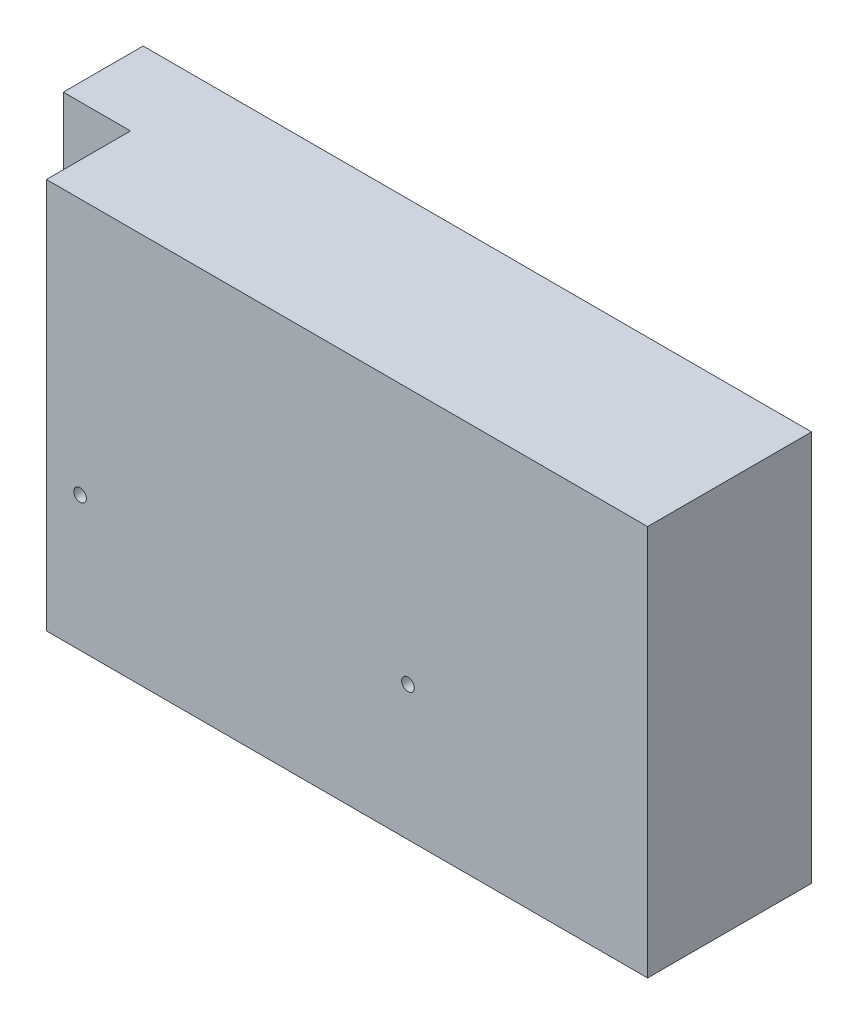
ISO-10303-21;
HEADER;
FILE_DESCRIPTION(('STEP AP214'),'2;1');
FILE_NAME('part.step','',(''),(''),'','','');
FILE_SCHEMA(('AUTOMOTIVE_DESIGN { 1 0 10303 214 1 1 1 1 }'));
ENDSEC;
DATA;
#1=APPLICATION_CONTEXT('core data for automotive mechanical design processes');
#2=APPLICATION_PROTOCOL_DEFINITION('international standard','automotive_design',2000,#1);
#3=PRODUCT_CONTEXT('',#1,'mechanical');
#4=PRODUCT('Part','Part','',(#3));
#5=PRODUCT_RELATED_PRODUCT_CATEGORY('part','',(#4));
#6=PRODUCT_DEFINITION_FORMATION('','',#4);
#7=PRODUCT_DEFINITION_CONTEXT('part definition',#1,'design');
#8=PRODUCT_DEFINITION('design','',#6,#7);
#9=PRODUCT_DEFINITION_SHAPE('','',#8);
#10=(LENGTH_UNIT() NAMED_UNIT(*) SI_UNIT(.MILLI.,.METRE.));
#11=(NAMED_UNIT(*) PLANE_ANGLE_UNIT() SI_UNIT($,.RADIAN.));
#12=(NAMED_UNIT(*) SI_UNIT($,.STERADIAN.) SOLID_ANGLE_UNIT());
#13=UNCERTAINTY_MEASURE_WITH_UNIT(LENGTH_MEASURE(1.E-05),#10,'distance_accuracy_value','');
#14=(GEOMETRIC_REPRESENTATION_CONTEXT(3) GLOBAL_UNCERTAINTY_ASSIGNED_CONTEXT((#13)) GLOBAL_UNIT_ASSIGNED_CONTEXT((#10,
#11,#12)) REPRESENTATION_CONTEXT('',''));
#15=CARTESIAN_POINT('',(0.,0.,0.));
#16=DIRECTION('',(0.,0.,1.));
#17=DIRECTION('',(1.,0.,0.));
#18=AXIS2_PLACEMENT_3D('',#15,#16,#17);
#19=CARTESIAN_POINT('',(-79.5,46.5,39.));
#20=DIRECTION('',(1.,0.,0.));
#21=DIRECTION('',(0.,0.,-1.));
#22=AXIS2_PLACEMENT_3D('',#19,#20,#21);
#23=PLANE('',#22);
#24=DIRECTION('',(0.,-1.,0.));
#25=VECTOR('',#24,1.);
#26=CARTESIAN_POINT('',(-79.5,46.5,19.));
#27=LINE('',#26,#25);
#28=CARTESIAN_POINT('',(-79.5,46.5,19.));
#29=VERTEX_POINT('',#28);
#30=CARTESIAN_POINT('',(-79.5,-46.5,19.));
#31=VERTEX_POINT('',#30);
#32=EDGE_CURVE('E113',#29,#31,#27,.T.);
#33=ORIENTED_EDGE('',*,*,#32,.F.);
#34=DIRECTION('',(0.,0.,-1.));
#35=VECTOR('',#34,1.);
#36=CARTESIAN_POINT('',(-79.5,46.5,39.));
#37=LINE('',#36,#35);
#38=CARTESIAN_POINT('',(-79.5,46.5,0.));
#39=VERTEX_POINT('',#38);
#40=EDGE_CURVE('E42',#29,#39,#37,.T.);
#41=ORIENTED_EDGE('',*,*,#40,.T.);
#42=DIRECTION('',(0.,-1.,0.));
#43=VECTOR('',#42,1.);
#44=CARTESIAN_POINT('',(-79.5,46.5,0.));
#45=LINE('',#44,#43);
#46=CARTESIAN_POINT('',(-79.5,-46.5,0.));
#47=VERTEX_POINT('',#46);
#48=EDGE_CURVE('E89',#39,#47,#45,.T.);
#49=ORIENTED_EDGE('',*,*,#48,.T.);
#50=DIRECTION('',(0.,0.,-1.));
#51=VECTOR('',#50,1.);
#52=CARTESIAN_POINT('',(-79.5,-46.5,39.));
#53=LINE('',#52,#51);
#54=EDGE_CURVE('E83',#31,#47,#53,.T.);
#55=ORIENTED_EDGE('',*,*,#54,.F.);
#56=EDGE_LOOP('',(#33,#41,#49,#55));
#57=FACE_BOUND('',#56,.T.);
#58=ADVANCED_FACE('F34',(#57),#23,.F.);
#59=CARTESIAN_POINT('',(79.5,46.5,39.));
#60=DIRECTION('',(-1.,0.,0.));
#61=DIRECTION('',(0.,-1.,0.));
#62=AXIS2_PLACEMENT_3D('',#59,#60,#61);
#63=PLANE('',#62);
#64=DIRECTION('',(0.,1.,0.));
#65=VECTOR('',#64,1.);
#66=CARTESIAN_POINT('',(79.5,46.5,0.));
#67=LINE('',#66,#65);
#68=CARTESIAN_POINT('',(79.5,-46.5,0.));
#69=VERTEX_POINT('',#68);
#70=CARTESIAN_POINT('',(79.5,46.5,0.));
#71=VERTEX_POINT('',#70);
#72=EDGE_CURVE('E94',#69,#71,#67,.T.);
#73=ORIENTED_EDGE('',*,*,#72,.T.);
#74=DIRECTION('',(0.,0.,-1.));
#75=VECTOR('',#74,1.);
#76=CARTESIAN_POINT('',(79.5,46.5,39.));
#77=LINE('',#76,#75);
#78=CARTESIAN_POINT('',(79.5,46.5,39.));
#79=VERTEX_POINT('',#78);
#80=EDGE_CURVE('E11',#79,#71,#77,.T.);
#81=ORIENTED_EDGE('',*,*,#80,.F.);
#82=DIRECTION('',(0.,1.,0.));
#83=VECTOR('',#82,1.);
#84=CARTESIAN_POINT('',(79.5,46.5,39.));
#85=LINE('',#84,#83);
#86=CARTESIAN_POINT('',(79.5,-46.5,39.));
#87=VERTEX_POINT('',#86);
#88=EDGE_CURVE('E88',#87,#79,#85,.T.);
#89=ORIENTED_EDGE('',*,*,#88,.F.);
#90=DIRECTION('',(0.,0.,-1.));
#91=VECTOR('',#90,1.);
#92=CARTESIAN_POINT('',(79.5,-46.5,39.));
#93=LINE('',#92,#91);
#94=EDGE_CURVE('E79',#87,#69,#93,.T.);
#95=ORIENTED_EDGE('',*,*,#94,.T.);
#96=EDGE_LOOP('',(#73,#81,#89,#95));
#97=FACE_BOUND('',#96,.T.);
#98=ADVANCED_FACE('F36',(#97),#63,.F.);
#99=CARTESIAN_POINT('',(-79.5,46.5,39.));
#100=DIRECTION('',(0.,-1.,0.));
#101=DIRECTION('',(0.,0.,-1.));
#102=AXIS2_PLACEMENT_3D('',#99,#100,#101);
#103=PLANE('',#102);
#104=DIRECTION('',(-1.,0.,0.));
#105=VECTOR('',#104,1.);
#106=CARTESIAN_POINT('',(-79.5,46.5,19.));
#107=LINE('',#106,#105);
#108=CARTESIAN_POINT('',(-63.5,46.5,19.));
#109=VERTEX_POINT('',#108);
#110=EDGE_CURVE('E136',#109,#29,#107,.T.);
#111=ORIENTED_EDGE('',*,*,#110,.F.);
#112=DIRECTION('',(0.,0.,1.));
#113=VECTOR('',#112,1.);
#114=CARTESIAN_POINT('',(-63.5,46.5,19.));
#115=LINE('',#114,#113);
#116=CARTESIAN_POINT('',(-63.5,46.5,39.));
#117=VERTEX_POINT('',#116);
#118=EDGE_CURVE('E122',#109,#117,#115,.T.);
#119=ORIENTED_EDGE('',*,*,#118,.T.);
#120=DIRECTION('',(-1.,0.,0.));
#121=VECTOR('',#120,1.);
#122=CARTESIAN_POINT('',(-79.5,46.5,39.));
#123=LINE('',#122,#121);
#124=EDGE_CURVE('E119',#79,#117,#123,.T.);
#125=ORIENTED_EDGE('',*,*,#124,.F.);
#126=ORIENTED_EDGE('',*,*,#80,.T.);
#127=DIRECTION('',(-1.,0.,0.));
#128=VECTOR('',#127,1.);
#129=CARTESIAN_POINT('',(-79.5,46.5,0.));
#130=LINE('',#129,#128);
#131=EDGE_CURVE('E98',#71,#39,#130,.T.);
#132=ORIENTED_EDGE('',*,*,#131,.T.);
#133=ORIENTED_EDGE('',*,*,#40,.F.);
#134=EDGE_LOOP('',(#111,#119,#125,#126,#132,#133));
#135=FACE_BOUND('',#134,.T.);
#136=ADVANCED_FACE('F116',(#135),#103,.F.);
#137=CARTESIAN_POINT('',(-79.5,-46.5,39.));
#138=DIRECTION('',(0.,1.,0.));
#139=DIRECTION('',(0.,0.,1.));
#140=AXIS2_PLACEMENT_3D('',#137,#138,#139);
#141=PLANE('',#140);
#142=DIRECTION('',(1.,0.,0.));
#143=VECTOR('',#142,1.);
#144=CARTESIAN_POINT('',(-79.5,-46.5,39.));
#145=LINE('',#144,#143);
#146=CARTESIAN_POINT('',(-63.5,-46.5,39.));
#147=VERTEX_POINT('',#146);
#148=EDGE_CURVE('E57',#147,#87,#145,.T.);
#149=ORIENTED_EDGE('',*,*,#148,.F.);
#150=DIRECTION('',(0.,0.,1.));
#151=VECTOR('',#150,1.);
#152=CARTESIAN_POINT('',(-63.5,-46.5,19.));
#153=LINE('',#152,#151);
#154=CARTESIAN_POINT('',(-63.5,-46.5,19.));
#155=VERTEX_POINT('',#154);
#156=EDGE_CURVE('E49',#155,#147,#153,.T.);
#157=ORIENTED_EDGE('',*,*,#156,.F.);
#158=DIRECTION('',(1.,0.,0.));
#159=VECTOR('',#158,1.);
#160=CARTESIAN_POINT('',(-79.5,-46.5,19.));
#161=LINE('',#160,#159);
#162=EDGE_CURVE('E145',#31,#155,#161,.T.);
#163=ORIENTED_EDGE('',*,*,#162,.F.);
#164=ORIENTED_EDGE('',*,*,#54,.T.);
#165=DIRECTION('',(1.,0.,0.));
#166=VECTOR('',#165,1.);
#167=CARTESIAN_POINT('',(-79.5,-46.5,0.));
#168=LINE('',#167,#166);
#169=EDGE_CURVE('E76',#47,#69,#168,.T.);
#170=ORIENTED_EDGE('',*,*,#169,.T.);
#171=ORIENTED_EDGE('',*,*,#94,.F.);
#172=EDGE_LOOP('',(#149,#157,#163,#164,#170,#171));
#173=FACE_BOUND('',#172,.T.);
#174=ADVANCED_FACE('F78',(#173),#141,.F.);
#175=CARTESIAN_POINT('',(0.,0.,39.));
#176=DIRECTION('',(0.,0.,1.));
#177=DIRECTION('',(1.,0.,0.));
#178=AXIS2_PLACEMENT_3D('',#175,#176,#177);
#179=PLANE('',#178);
#180=DIRECTION('',(0.,1.,0.));
#181=VECTOR('',#180,1.);
#182=CARTESIAN_POINT('',(-63.5,46.5,39.));
#183=LINE('',#182,#181);
#184=EDGE_CURVE('E138',#147,#117,#183,.T.);
#185=ORIENTED_EDGE('',*,*,#184,.F.);
#186=ORIENTED_EDGE('',*,*,#148,.T.);
#187=ORIENTED_EDGE('',*,*,#88,.T.);
#188=ORIENTED_EDGE('',*,*,#124,.T.);
#189=EDGE_LOOP('',(#185,#186,#187,#188));
#190=FACE_BOUND('',#189,.T.);
#191=CARTESIAN_POINT('',(22.5,-14.5,39.));
#192=DIRECTION('',(0.,0.,-1.));
#193=DIRECTION('',(-1.,0.,0.));
#194=AXIS2_PLACEMENT_3D('',#191,#192,#193);
#195=CIRCLE('',#194,1.5);
#196=CARTESIAN_POINT('',(21.,-14.5,39.));
#197=VERTEX_POINT('',#196);
#198=EDGE_CURVE('E99',#197,#197,#195,.T.);
#199=ORIENTED_EDGE('',*,*,#198,.T.);
#200=EDGE_LOOP('',(#199));
#201=FACE_BOUND('',#200,.T.);
#202=CARTESIAN_POINT('',(-55.5,-14.5,39.));
#203=DIRECTION('',(0.,0.,-1.));
#204=DIRECTION('',(-1.,0.,0.));
#205=AXIS2_PLACEMENT_3D('',#202,#203,#204);
#206=CIRCLE('',#205,1.5);
#207=CARTESIAN_POINT('',(-57.,-14.5,39.));
#208=VERTEX_POINT('',#207);
#209=EDGE_CURVE('E130',#208,#208,#206,.T.);
#210=ORIENTED_EDGE('',*,*,#209,.T.);
#211=EDGE_LOOP('',(#210));
#212=FACE_BOUND('',#211,.T.);
#213=ADVANCED_FACE('F123',(#190,#201,#212),#179,.T.);
#214=CARTESIAN_POINT('',(0.,0.,0.));
#215=DIRECTION('',(0.,0.,1.));
#216=DIRECTION('',(1.,0.,0.));
#217=AXIS2_PLACEMENT_3D('',#214,#215,#216);
#218=PLANE('',#217);
#219=CARTESIAN_POINT('',(22.5,-14.5,0.));
#220=DIRECTION('',(0.,0.,-1.));
#221=DIRECTION('',(-1.,0.,0.));
#222=AXIS2_PLACEMENT_3D('',#219,#220,#221);
#223=CIRCLE('',#222,1.5);
#224=CARTESIAN_POINT('',(21.,-14.5,0.));
#225=VERTEX_POINT('',#224);
#226=EDGE_CURVE('E103',#225,#225,#223,.T.);
#227=ORIENTED_EDGE('',*,*,#226,.F.);
#228=EDGE_LOOP('',(#227));
#229=FACE_BOUND('',#228,.T.);
#230=CARTESIAN_POINT('',(-55.5,-14.5,0.));
#231=DIRECTION('',(0.,0.,-1.));
#232=DIRECTION('',(-1.,0.,0.));
#233=AXIS2_PLACEMENT_3D('',#230,#231,#232);
#234=CIRCLE('',#233,1.5);
#235=CARTESIAN_POINT('',(-57.,-14.5,0.));
#236=VERTEX_POINT('',#235);
#237=EDGE_CURVE('E127',#236,#236,#234,.T.);
#238=ORIENTED_EDGE('',*,*,#237,.F.);
#239=EDGE_LOOP('',(#238));
#240=FACE_BOUND('',#239,.T.);
#241=ORIENTED_EDGE('',*,*,#72,.F.);
#242=ORIENTED_EDGE('',*,*,#169,.F.);
#243=ORIENTED_EDGE('',*,*,#48,.F.);
#244=ORIENTED_EDGE('',*,*,#131,.F.);
#245=EDGE_LOOP('',(#241,#242,#243,#244));
#246=FACE_BOUND('',#245,.T.);
#247=ADVANCED_FACE('F96',(#229,#240,#246),#218,.F.);
#248=CARTESIAN_POINT('',(-55.5,-14.5,39.));
#249=DIRECTION('',(0.,0.,-1.));
#250=DIRECTION('',(-1.,0.,0.));
#251=AXIS2_PLACEMENT_3D('',#248,#249,#250);
#252=CYLINDRICAL_SURFACE('',#251,1.5);
#253=ORIENTED_EDGE('',*,*,#209,.F.);
#254=EDGE_LOOP('',(#253));
#255=FACE_BOUND('',#254,.T.);
#256=ORIENTED_EDGE('',*,*,#237,.T.);
#257=EDGE_LOOP('',(#256));
#258=FACE_BOUND('',#257,.T.);
#259=ADVANCED_FACE('F166',(#255,#258),#252,.F.);
#260=CARTESIAN_POINT('',(22.5,-14.5,39.));
#261=DIRECTION('',(0.,0.,-1.));
#262=DIRECTION('',(-1.,0.,0.));
#263=AXIS2_PLACEMENT_3D('',#260,#261,#262);
#264=CYLINDRICAL_SURFACE('',#263,1.5);
#265=ORIENTED_EDGE('',*,*,#198,.F.);
#266=EDGE_LOOP('',(#265));
#267=FACE_BOUND('',#266,.T.);
#268=ORIENTED_EDGE('',*,*,#226,.T.);
#269=EDGE_LOOP('',(#268));
#270=FACE_BOUND('',#269,.T.);
#271=ADVANCED_FACE('F159',(#267,#270),#264,.F.);
#272=CARTESIAN_POINT('',(-63.5,46.5,19.));
#273=DIRECTION('',(1.,0.,0.));
#274=DIRECTION('',(0.,1.,0.));
#275=AXIS2_PLACEMENT_3D('',#272,#273,#274);
#276=PLANE('',#275);
#277=ORIENTED_EDGE('',*,*,#184,.T.);
#278=ORIENTED_EDGE('',*,*,#118,.F.);
#279=DIRECTION('',(0.,1.,0.));
#280=VECTOR('',#279,1.);
#281=CARTESIAN_POINT('',(-63.5,46.5,19.));
#282=LINE('',#281,#280);
#283=EDGE_CURVE('E142',#155,#109,#282,.T.);
#284=ORIENTED_EDGE('',*,*,#283,.F.);
#285=ORIENTED_EDGE('',*,*,#156,.T.);
#286=EDGE_LOOP('',(#277,#278,#284,#285));
#287=FACE_BOUND('',#286,.T.);
#288=ADVANCED_FACE('F157',(#287),#276,.F.);
#289=CARTESIAN_POINT('',(0.,0.,19.));
#290=DIRECTION('',(0.,0.,1.));
#291=DIRECTION('',(1.,0.,0.));
#292=AXIS2_PLACEMENT_3D('',#289,#290,#291);
#293=PLANE('',#292);
#294=ORIENTED_EDGE('',*,*,#32,.T.);
#295=ORIENTED_EDGE('',*,*,#162,.T.);
#296=ORIENTED_EDGE('',*,*,#283,.T.);
#297=ORIENTED_EDGE('',*,*,#110,.T.);
#298=EDGE_LOOP('',(#294,#295,#296,#297));
#299=FACE_BOUND('',#298,.T.);
#300=ADVANCED_FACE('F150',(#299),#293,.T.);
#301=CLOSED_SHELL('',(#58,#98,#136,#174,#213,#247,#259,#271,#288,#300));
#302=MANIFOLD_SOLID_BREP('B2',#301);
#303=ADVANCED_BREP_SHAPE_REPRESENTATION('',(#18,#302),#14);
#304=SHAPE_DEFINITION_REPRESENTATION(#9,#303);
ENDSEC;
END-ISO-10303-21;
